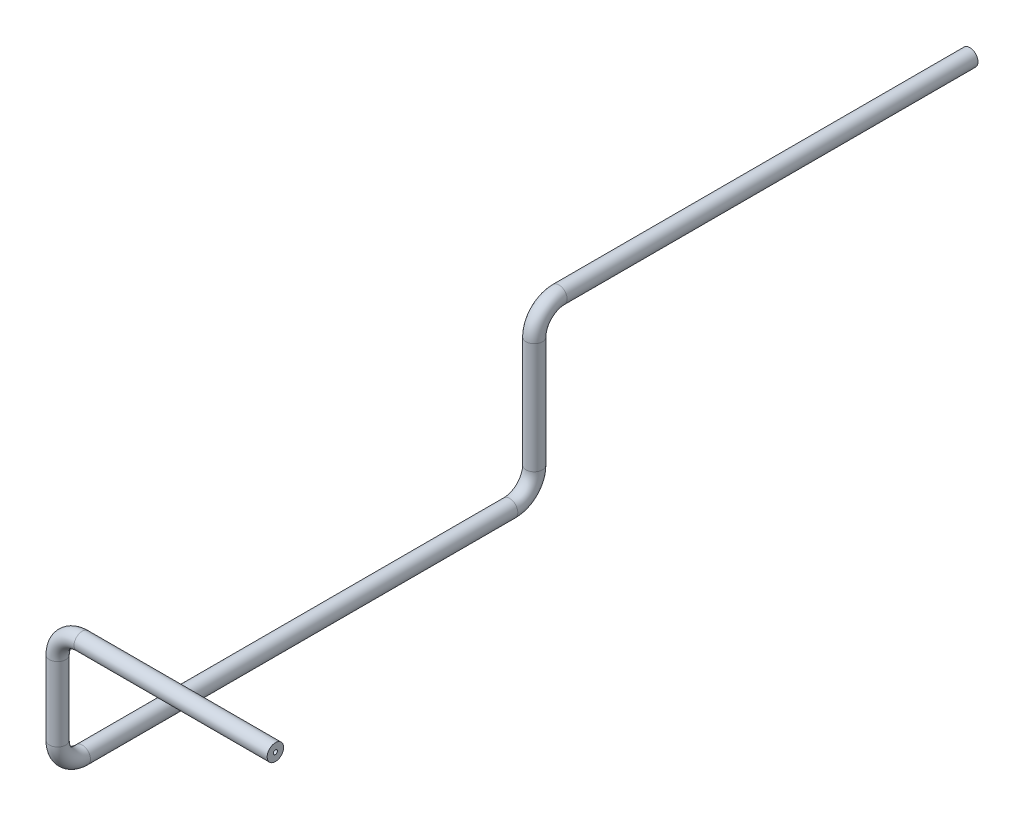
ISO-10303-21;
HEADER;
FILE_DESCRIPTION(('STEP AP214'),'2;1');
FILE_NAME('part.step','',(''),(''),'','','');
FILE_SCHEMA(('AUTOMOTIVE_DESIGN { 1 0 10303 214 1 1 1 1 }'));
ENDSEC;
DATA;
#1=APPLICATION_CONTEXT('core data for automotive mechanical design processes');
#2=APPLICATION_PROTOCOL_DEFINITION('international standard','automotive_design',2000,#1);
#3=PRODUCT_CONTEXT('',#1,'mechanical');
#4=PRODUCT('Part','Part','',(#3));
#5=PRODUCT_RELATED_PRODUCT_CATEGORY('part','',(#4));
#6=PRODUCT_DEFINITION_FORMATION('','',#4);
#7=PRODUCT_DEFINITION_CONTEXT('part definition',#1,'design');
#8=PRODUCT_DEFINITION('design','',#6,#7);
#9=PRODUCT_DEFINITION_SHAPE('','',#8);
#10=(LENGTH_UNIT() NAMED_UNIT(*) SI_UNIT(.MILLI.,.METRE.));
#11=(NAMED_UNIT(*) PLANE_ANGLE_UNIT() SI_UNIT($,.RADIAN.));
#12=(NAMED_UNIT(*) SI_UNIT($,.STERADIAN.) SOLID_ANGLE_UNIT());
#13=UNCERTAINTY_MEASURE_WITH_UNIT(LENGTH_MEASURE(1.E-05),#10,'distance_accuracy_value','');
#14=(GEOMETRIC_REPRESENTATION_CONTEXT(3) GLOBAL_UNCERTAINTY_ASSIGNED_CONTEXT((#13)) GLOBAL_UNIT_ASSIGNED_CONTEXT((#10,
#11,#12)) REPRESENTATION_CONTEXT('',''));
#15=CARTESIAN_POINT('',(0.,0.,0.));
#16=DIRECTION('',(0.,0.,1.));
#17=DIRECTION('',(1.,0.,0.));
#18=AXIS2_PLACEMENT_3D('',#15,#16,#17);
#19=CARTESIAN_POINT('',(-150.,480.,14.));
#20=DIRECTION('',(0.,0.,-1.));
#21=DIRECTION('',(0.,-1.,0.));
#22=AXIS2_PLACEMENT_3D('',#19,#20,#21);
#23=PLANE('',#22);
#24=CARTESIAN_POINT('',(-150.,480.,14.));
#25=DIRECTION('',(0.,0.,-1.));
#26=DIRECTION('',(0.,-1.,0.));
#27=AXIS2_PLACEMENT_3D('',#24,#25,#26);
#28=CIRCLE('',#27,0.5);
#29=CARTESIAN_POINT('',(-150.,479.5,14.));
#30=VERTEX_POINT('',#29);
#31=EDGE_CURVE('E311',#30,#30,#28,.T.);
#32=ORIENTED_EDGE('',*,*,#31,.F.);
#33=EDGE_LOOP('',(#32));
#34=FACE_BOUND('',#33,.T.);
#35=CARTESIAN_POINT('',(-150.,480.,14.));
#36=DIRECTION('',(0.,0.,-1.));
#37=DIRECTION('',(-1.,0.,0.));
#38=AXIS2_PLACEMENT_3D('',#35,#36,#37);
#39=CIRCLE('',#38,2.);
#40=CARTESIAN_POINT('',(-152.,480.,14.));
#41=VERTEX_POINT('',#40);
#42=EDGE_CURVE('E75',#41,#41,#39,.T.);
#43=ORIENTED_EDGE('',*,*,#42,.T.);
#44=EDGE_LOOP('',(#43));
#45=FACE_BOUND('',#44,.T.);
#46=ADVANCED_FACE('F52',(#34,#45),#23,.T.);
#47=CARTESIAN_POINT('',(-97.,471.,236.));
#48=DIRECTION('',(-1.,0.,0.));
#49=DIRECTION('',(0.,0.,1.));
#50=AXIS2_PLACEMENT_3D('',#47,#48,#49);
#51=PLANE('',#50);
#52=CARTESIAN_POINT('',(-97.,471.,236.));
#53=DIRECTION('',(-1.,0.,0.));
#54=DIRECTION('',(0.,0.,1.));
#55=AXIS2_PLACEMENT_3D('',#52,#53,#54);
#56=CIRCLE('',#55,0.5);
#57=CARTESIAN_POINT('',(-97.,471.,236.5));
#58=VERTEX_POINT('',#57);
#59=EDGE_CURVE('E73',#58,#58,#56,.T.);
#60=ORIENTED_EDGE('',*,*,#59,.T.);
#61=EDGE_LOOP('',(#60));
#62=FACE_BOUND('',#61,.T.);
#63=CARTESIAN_POINT('',(-97.,471.,236.));
#64=DIRECTION('',(-1.,0.,0.));
#65=DIRECTION('',(0.,0.,1.));
#66=AXIS2_PLACEMENT_3D('',#63,#64,#65);
#67=CIRCLE('',#66,2.);
#68=CARTESIAN_POINT('',(-97.,471.,238.));
#69=VERTEX_POINT('',#68);
#70=EDGE_CURVE('E11',#69,#69,#67,.T.);
#71=ORIENTED_EDGE('',*,*,#70,.F.);
#72=EDGE_LOOP('',(#71));
#73=FACE_BOUND('',#72,.T.);
#74=ADVANCED_FACE('F162',(#62,#73),#51,.F.);
#75=CARTESIAN_POINT('',(-150.,480.,14.));
#76=DIRECTION('',(0.,0.,1.));
#77=DIRECTION('',(1.,0.,0.));
#78=AXIS2_PLACEMENT_3D('',#75,#76,#77);
#79=CYLINDRICAL_SURFACE('',#78,2.);
#80=CARTESIAN_POINT('',(-150.,480.,114.));
#81=DIRECTION('',(0.,0.,1.));
#82=DIRECTION('',(1.,0.,0.));
#83=AXIS2_PLACEMENT_3D('',#80,#81,#82);
#84=CIRCLE('',#83,2.);
#85=CARTESIAN_POINT('',(-150.,482.,114.));
#86=VERTEX_POINT('',#85);
#87=EDGE_CURVE('E74',#86,#86,#84,.F.);
#88=ORIENTED_EDGE('',*,*,#87,.T.);
#89=EDGE_LOOP('',(#88));
#90=FACE_BOUND('',#89,.T.);
#91=ORIENTED_EDGE('',*,*,#42,.F.);
#92=EDGE_LOOP('',(#91));
#93=FACE_BOUND('',#92,.T.);
#94=ADVANCED_FACE('F167',(#90,#93),#79,.T.);
#95=CARTESIAN_POINT('',(-150.,474.,114.));
#96=DIRECTION('',(1.,0.,0.));
#97=DIRECTION('',(0.,0.,-1.));
#98=AXIS2_PLACEMENT_3D('',#95,#96,#97);
#99=TOROIDAL_SURFACE('',#98,6.00000000000001,2.);
#100=CARTESIAN_POINT('',(-150.,474.,120.));
#101=DIRECTION('',(0.,1.,0.));
#102=DIRECTION('',(0.,0.,1.));
#103=AXIS2_PLACEMENT_3D('',#100,#101,#102);
#104=CIRCLE('',#103,2.);
#105=CARTESIAN_POINT('',(-150.,474.,122.));
#106=VERTEX_POINT('',#105);
#107=EDGE_CURVE('E78',#106,#106,#104,.T.);
#108=CARTESIAN_POINT('',(-150.,474.,114.));
#109=DIRECTION('',(1.,0.,0.));
#110=DIRECTION('',(0.,0.,-1.));
#111=AXIS2_PLACEMENT_3D('',#108,#109,#110);
#112=CIRCLE('',#111,8.00000000000001);
#113=EDGE_CURVE('',#86,#106,#112,.T.);
#114=ORIENTED_EDGE('',*,*,#87,.F.);
#115=ORIENTED_EDGE('',*,*,#107,.T.);
#116=ORIENTED_EDGE('',*,*,#113,.T.);
#117=ORIENTED_EDGE('',*,*,#113,.F.);
#118=EDGE_LOOP('',(#114,#116,#115,#117));
#119=FACE_BOUND('',#118,.T.);
#120=ADVANCED_FACE('F171',(#119),#99,.T.);
#121=CARTESIAN_POINT('',(-150.,474.,120.));
#122=DIRECTION('',(0.,-1.,0.));
#123=DIRECTION('',(0.,0.,-1.));
#124=AXIS2_PLACEMENT_3D('',#121,#122,#123);
#125=CYLINDRICAL_SURFACE('',#124,2.);
#126=CARTESIAN_POINT('',(-150.,447.,120.));
#127=DIRECTION('',(0.,-1.,0.));
#128=DIRECTION('',(0.,0.,-1.));
#129=AXIS2_PLACEMENT_3D('',#126,#127,#128);
#130=CIRCLE('',#129,2.);
#131=CARTESIAN_POINT('',(-150.,447.,118.));
#132=VERTEX_POINT('',#131);
#133=EDGE_CURVE('E91',#132,#132,#130,.F.);
#134=ORIENTED_EDGE('',*,*,#133,.T.);
#135=EDGE_LOOP('',(#134));
#136=FACE_BOUND('',#135,.T.);
#137=ORIENTED_EDGE('',*,*,#107,.F.);
#138=EDGE_LOOP('',(#137));
#139=FACE_BOUND('',#138,.T.);
#140=ADVANCED_FACE('F176',(#136,#139),#125,.T.);
#141=CARTESIAN_POINT('',(-150.,447.,126.));
#142=DIRECTION('',(-1.,0.,0.));
#143=DIRECTION('',(0.,0.,1.));
#144=AXIS2_PLACEMENT_3D('',#141,#142,#143);
#145=TOROIDAL_SURFACE('',#144,6.00000000000003,2.);
#146=CARTESIAN_POINT('',(-150.,441.,126.));
#147=DIRECTION('',(0.,0.,-1.));
#148=DIRECTION('',(0.,1.,0.));
#149=AXIS2_PLACEMENT_3D('',#146,#147,#148);
#150=CIRCLE('',#149,2.);
#151=CARTESIAN_POINT('',(-150.,439.,126.));
#152=VERTEX_POINT('',#151);
#153=EDGE_CURVE('E96',#152,#152,#150,.T.);
#154=CARTESIAN_POINT('',(-150.,447.,126.));
#155=DIRECTION('',(-1.,0.,0.));
#156=DIRECTION('',(0.,0.,1.));
#157=AXIS2_PLACEMENT_3D('',#154,#155,#156);
#158=CIRCLE('',#157,8.00000000000003);
#159=EDGE_CURVE('',#132,#152,#158,.T.);
#160=ORIENTED_EDGE('',*,*,#133,.F.);
#161=ORIENTED_EDGE('',*,*,#153,.T.);
#162=ORIENTED_EDGE('',*,*,#159,.T.);
#163=ORIENTED_EDGE('',*,*,#159,.F.);
#164=EDGE_LOOP('',(#160,#162,#161,#163));
#165=FACE_BOUND('',#164,.T.);
#166=ADVANCED_FACE('F179',(#165),#145,.T.);
#167=CARTESIAN_POINT('',(-150.,441.,126.));
#168=DIRECTION('',(0.,0.,1.));
#169=DIRECTION('',(1.,0.,0.));
#170=AXIS2_PLACEMENT_3D('',#167,#168,#169);
#171=CYLINDRICAL_SURFACE('',#170,2.);
#172=CARTESIAN_POINT('',(-150.,441.,230.));
#173=DIRECTION('',(0.,0.,1.));
#174=DIRECTION('',(1.,0.,0.));
#175=AXIS2_PLACEMENT_3D('',#172,#173,#174);
#176=CIRCLE('',#175,2.);
#177=CARTESIAN_POINT('',(-150.,439.,230.));
#178=VERTEX_POINT('',#177);
#179=EDGE_CURVE('E97',#178,#178,#176,.F.);
#180=ORIENTED_EDGE('',*,*,#179,.T.);
#181=EDGE_LOOP('',(#180));
#182=FACE_BOUND('',#181,.T.);
#183=ORIENTED_EDGE('',*,*,#153,.F.);
#184=EDGE_LOOP('',(#183));
#185=FACE_BOUND('',#184,.T.);
#186=ADVANCED_FACE('F119',(#182,#185),#171,.T.);
#187=CARTESIAN_POINT('',(-150.,447.,230.));
#188=DIRECTION('',(-1.,0.,0.));
#189=DIRECTION('',(0.,0.,1.));
#190=AXIS2_PLACEMENT_3D('',#187,#188,#189);
#191=TOROIDAL_SURFACE('',#190,5.99999999999995,2.);
#192=CARTESIAN_POINT('',(-150.,447.,236.));
#193=DIRECTION('',(0.,-1.,0.));
#194=DIRECTION('',(0.,0.,-1.));
#195=AXIS2_PLACEMENT_3D('',#192,#193,#194);
#196=CIRCLE('',#195,2.);
#197=CARTESIAN_POINT('',(-150.,447.,238.));
#198=VERTEX_POINT('',#197);
#199=EDGE_CURVE('E68',#198,#198,#196,.T.);
#200=CARTESIAN_POINT('',(-150.,447.,230.));
#201=DIRECTION('',(-1.,0.,0.));
#202=DIRECTION('',(0.,0.,1.));
#203=AXIS2_PLACEMENT_3D('',#200,#201,#202);
#204=CIRCLE('',#203,7.99999999999995);
#205=EDGE_CURVE('',#178,#198,#204,.T.);
#206=ORIENTED_EDGE('',*,*,#179,.F.);
#207=ORIENTED_EDGE('',*,*,#199,.T.);
#208=ORIENTED_EDGE('',*,*,#205,.T.);
#209=ORIENTED_EDGE('',*,*,#205,.F.);
#210=EDGE_LOOP('',(#206,#208,#207,#209));
#211=FACE_BOUND('',#210,.T.);
#212=ADVANCED_FACE('F102',(#211),#191,.T.);
#213=CARTESIAN_POINT('',(-150.,447.,236.));
#214=DIRECTION('',(0.,1.,0.));
#215=DIRECTION('',(0.,0.,1.));
#216=AXIS2_PLACEMENT_3D('',#213,#214,#215);
#217=CYLINDRICAL_SURFACE('',#216,2.);
#218=CARTESIAN_POINT('',(-150.,465.,236.));
#219=DIRECTION('',(0.,1.,0.));
#220=DIRECTION('',(0.,0.,1.));
#221=AXIS2_PLACEMENT_3D('',#218,#219,#220);
#222=CIRCLE('',#221,2.);
#223=CARTESIAN_POINT('',(-152.,465.,236.));
#224=VERTEX_POINT('',#223);
#225=EDGE_CURVE('E63',#224,#224,#222,.F.);
#226=ORIENTED_EDGE('',*,*,#225,.T.);
#227=EDGE_LOOP('',(#226));
#228=FACE_BOUND('',#227,.T.);
#229=ORIENTED_EDGE('',*,*,#199,.F.);
#230=EDGE_LOOP('',(#229));
#231=FACE_BOUND('',#230,.T.);
#232=ADVANCED_FACE('F110',(#228,#231),#217,.T.);
#233=CARTESIAN_POINT('',(-144.,465.,236.));
#234=DIRECTION('',(0.,0.,-1.));
#235=DIRECTION('',(-1.,0.,0.));
#236=AXIS2_PLACEMENT_3D('',#233,#234,#235);
#237=TOROIDAL_SURFACE('',#236,5.99999999999998,2.);
#238=CARTESIAN_POINT('',(-144.,471.,236.));
#239=DIRECTION('',(-1.,0.,0.));
#240=DIRECTION('',(0.,-1.,0.));
#241=AXIS2_PLACEMENT_3D('',#238,#239,#240);
#242=CIRCLE('',#241,2.);
#243=CARTESIAN_POINT('',(-144.,473.,236.));
#244=VERTEX_POINT('',#243);
#245=EDGE_CURVE('E58',#244,#244,#242,.T.);
#246=CARTESIAN_POINT('',(-144.,465.,236.));
#247=DIRECTION('',(0.,0.,-1.));
#248=DIRECTION('',(-1.,0.,0.));
#249=AXIS2_PLACEMENT_3D('',#246,#247,#248);
#250=CIRCLE('',#249,7.99999999999998);
#251=EDGE_CURVE('',#224,#244,#250,.T.);
#252=ORIENTED_EDGE('',*,*,#225,.F.);
#253=ORIENTED_EDGE('',*,*,#245,.T.);
#254=ORIENTED_EDGE('',*,*,#251,.T.);
#255=ORIENTED_EDGE('',*,*,#251,.F.);
#256=EDGE_LOOP('',(#252,#254,#253,#255));
#257=FACE_BOUND('',#256,.T.);
#258=ADVANCED_FACE('F108',(#257),#237,.T.);
#259=CARTESIAN_POINT('',(-144.,471.,236.));
#260=DIRECTION('',(1.,0.,0.));
#261=DIRECTION('',(0.,0.,-1.));
#262=AXIS2_PLACEMENT_3D('',#259,#260,#261);
#263=CYLINDRICAL_SURFACE('',#262,2.);
#264=ORIENTED_EDGE('',*,*,#70,.T.);
#265=EDGE_LOOP('',(#264));
#266=FACE_BOUND('',#265,.T.);
#267=ORIENTED_EDGE('',*,*,#245,.F.);
#268=EDGE_LOOP('',(#267));
#269=FACE_BOUND('',#268,.T.);
#270=ADVANCED_FACE('F54',(#266,#269),#263,.T.);
#271=CARTESIAN_POINT('',(-150.,480.,14.));
#272=DIRECTION('',(0.,0.,1.));
#273=DIRECTION('',(1.,0.,0.));
#274=AXIS2_PLACEMENT_3D('',#271,#272,#273);
#275=CYLINDRICAL_SURFACE('',#274,0.5);
#276=CARTESIAN_POINT('',(-150.,480.,114.));
#277=DIRECTION('',(0.,0.,-1.));
#278=DIRECTION('',(0.,-1.,0.));
#279=AXIS2_PLACEMENT_3D('',#276,#277,#278);
#280=CIRCLE('',#279,0.5);
#281=CARTESIAN_POINT('',(-150.,480.5,114.));
#282=VERTEX_POINT('',#281);
#283=EDGE_CURVE('E314',#282,#282,#280,.T.);
#284=ORIENTED_EDGE('',*,*,#283,.F.);
#285=EDGE_LOOP('',(#284));
#286=FACE_BOUND('',#285,.T.);
#287=ORIENTED_EDGE('',*,*,#31,.T.);
#288=EDGE_LOOP('',(#287));
#289=FACE_BOUND('',#288,.T.);
#290=ADVANCED_FACE('F118',(#286,#289),#275,.F.);
#291=CARTESIAN_POINT('',(-150.,474.,114.));
#292=DIRECTION('',(1.,0.,0.));
#293=DIRECTION('',(0.,0.,-1.));
#294=AXIS2_PLACEMENT_3D('',#291,#292,#293);
#295=TOROIDAL_SURFACE('',#294,6.00000000000001,0.5);
#296=CARTESIAN_POINT('',(-150.,474.,120.));
#297=DIRECTION('',(0.,1.,0.));
#298=DIRECTION('',(0.,0.,-1.));
#299=AXIS2_PLACEMENT_3D('',#296,#297,#298);
#300=CIRCLE('',#299,0.5);
#301=CARTESIAN_POINT('',(-150.,474.,120.5));
#302=VERTEX_POINT('',#301);
#303=EDGE_CURVE('E320',#302,#302,#300,.T.);
#304=CARTESIAN_POINT('',(-150.,474.,114.));
#305=DIRECTION('',(1.,0.,0.));
#306=DIRECTION('',(0.,0.,-1.));
#307=AXIS2_PLACEMENT_3D('',#304,#305,#306);
#308=CIRCLE('',#307,6.50000000000001);
#309=EDGE_CURVE('',#282,#302,#308,.T.);
#310=ORIENTED_EDGE('',*,*,#283,.T.);
#311=ORIENTED_EDGE('',*,*,#303,.F.);
#312=ORIENTED_EDGE('',*,*,#309,.T.);
#313=ORIENTED_EDGE('',*,*,#309,.F.);
#314=EDGE_LOOP('',(#310,#312,#311,#313));
#315=FACE_BOUND('',#314,.T.);
#316=ADVANCED_FACE('F122',(#315),#295,.F.);
#317=CARTESIAN_POINT('',(-150.,474.,120.));
#318=DIRECTION('',(0.,-1.,0.));
#319=DIRECTION('',(0.,0.,-1.));
#320=AXIS2_PLACEMENT_3D('',#317,#318,#319);
#321=CYLINDRICAL_SURFACE('',#320,0.5);
#322=CARTESIAN_POINT('',(-150.,447.,120.));
#323=DIRECTION('',(0.,1.,0.));
#324=DIRECTION('',(0.,0.,-1.));
#325=AXIS2_PLACEMENT_3D('',#322,#323,#324);
#326=CIRCLE('',#325,0.5);
#327=CARTESIAN_POINT('',(-150.,447.,119.5));
#328=VERTEX_POINT('',#327);
#329=EDGE_CURVE('E325',#328,#328,#326,.T.);
#330=ORIENTED_EDGE('',*,*,#329,.F.);
#331=EDGE_LOOP('',(#330));
#332=FACE_BOUND('',#331,.T.);
#333=ORIENTED_EDGE('',*,*,#303,.T.);
#334=EDGE_LOOP('',(#333));
#335=FACE_BOUND('',#334,.T.);
#336=ADVANCED_FACE('F128',(#332,#335),#321,.F.);
#337=CARTESIAN_POINT('',(-150.,447.,126.));
#338=DIRECTION('',(-1.,0.,0.));
#339=DIRECTION('',(0.,0.,1.));
#340=AXIS2_PLACEMENT_3D('',#337,#338,#339);
#341=TOROIDAL_SURFACE('',#340,6.00000000000003,0.5);
#342=CARTESIAN_POINT('',(-150.,441.,126.));
#343=DIRECTION('',(0.,0.,-1.));
#344=DIRECTION('',(0.,-1.,0.));
#345=AXIS2_PLACEMENT_3D('',#342,#343,#344);
#346=CIRCLE('',#345,0.5);
#347=CARTESIAN_POINT('',(-150.,440.5,126.));
#348=VERTEX_POINT('',#347);
#349=EDGE_CURVE('E324',#348,#348,#346,.T.);
#350=CARTESIAN_POINT('',(-150.,447.,126.));
#351=DIRECTION('',(-1.,0.,0.));
#352=DIRECTION('',(0.,0.,1.));
#353=AXIS2_PLACEMENT_3D('',#350,#351,#352);
#354=CIRCLE('',#353,6.50000000000003);
#355=EDGE_CURVE('',#328,#348,#354,.T.);
#356=ORIENTED_EDGE('',*,*,#329,.T.);
#357=ORIENTED_EDGE('',*,*,#349,.F.);
#358=ORIENTED_EDGE('',*,*,#355,.T.);
#359=ORIENTED_EDGE('',*,*,#355,.F.);
#360=EDGE_LOOP('',(#356,#358,#357,#359));
#361=FACE_BOUND('',#360,.T.);
#362=ADVANCED_FACE('F137',(#361),#341,.F.);
#363=CARTESIAN_POINT('',(-150.,441.,126.));
#364=DIRECTION('',(0.,0.,1.));
#365=DIRECTION('',(1.,0.,0.));
#366=AXIS2_PLACEMENT_3D('',#363,#364,#365);
#367=CYLINDRICAL_SURFACE('',#366,0.5);
#368=CARTESIAN_POINT('',(-150.,441.,230.));
#369=DIRECTION('',(0.,0.,-1.));
#370=DIRECTION('',(0.,-1.,0.));
#371=AXIS2_PLACEMENT_3D('',#368,#369,#370);
#372=CIRCLE('',#371,0.5);
#373=CARTESIAN_POINT('',(-150.,440.5,230.));
#374=VERTEX_POINT('',#373);
#375=EDGE_CURVE('E327',#374,#374,#372,.T.);
#376=ORIENTED_EDGE('',*,*,#375,.F.);
#377=EDGE_LOOP('',(#376));
#378=FACE_BOUND('',#377,.T.);
#379=ORIENTED_EDGE('',*,*,#349,.T.);
#380=EDGE_LOOP('',(#379));
#381=FACE_BOUND('',#380,.T.);
#382=ADVANCED_FACE('F142',(#378,#381),#367,.F.);
#383=CARTESIAN_POINT('',(-150.,447.,230.));
#384=DIRECTION('',(-1.,0.,0.));
#385=DIRECTION('',(0.,0.,1.));
#386=AXIS2_PLACEMENT_3D('',#383,#384,#385);
#387=TOROIDAL_SURFACE('',#386,5.99999999999995,0.5);
#388=CARTESIAN_POINT('',(-150.,447.,236.));
#389=DIRECTION('',(0.,-1.,0.));
#390=DIRECTION('',(0.,0.,1.));
#391=AXIS2_PLACEMENT_3D('',#388,#389,#390);
#392=CIRCLE('',#391,0.5);
#393=CARTESIAN_POINT('',(-150.,447.,236.5));
#394=VERTEX_POINT('',#393);
#395=EDGE_CURVE('E332',#394,#394,#392,.T.);
#396=CARTESIAN_POINT('',(-150.,447.,230.));
#397=DIRECTION('',(-1.,0.,0.));
#398=DIRECTION('',(0.,0.,1.));
#399=AXIS2_PLACEMENT_3D('',#396,#397,#398);
#400=CIRCLE('',#399,6.49999999999995);
#401=EDGE_CURVE('',#374,#394,#400,.T.);
#402=ORIENTED_EDGE('',*,*,#375,.T.);
#403=ORIENTED_EDGE('',*,*,#395,.F.);
#404=ORIENTED_EDGE('',*,*,#401,.T.);
#405=ORIENTED_EDGE('',*,*,#401,.F.);
#406=EDGE_LOOP('',(#402,#404,#403,#405));
#407=FACE_BOUND('',#406,.T.);
#408=ADVANCED_FACE('F148',(#407),#387,.F.);
#409=CARTESIAN_POINT('',(-150.,447.,236.));
#410=DIRECTION('',(0.,1.,0.));
#411=DIRECTION('',(0.,0.,1.));
#412=AXIS2_PLACEMENT_3D('',#409,#410,#411);
#413=CYLINDRICAL_SURFACE('',#412,0.5);
#414=CARTESIAN_POINT('',(-150.,465.,236.));
#415=DIRECTION('',(0.,-1.,0.));
#416=DIRECTION('',(0.,0.,1.));
#417=AXIS2_PLACEMENT_3D('',#414,#415,#416);
#418=CIRCLE('',#417,0.5);
#419=CARTESIAN_POINT('',(-150.5,465.,236.));
#420=VERTEX_POINT('',#419);
#421=EDGE_CURVE('E87',#420,#420,#418,.T.);
#422=ORIENTED_EDGE('',*,*,#421,.F.);
#423=EDGE_LOOP('',(#422));
#424=FACE_BOUND('',#423,.T.);
#425=ORIENTED_EDGE('',*,*,#395,.T.);
#426=EDGE_LOOP('',(#425));
#427=FACE_BOUND('',#426,.T.);
#428=ADVANCED_FACE('F147',(#424,#427),#413,.F.);
#429=CARTESIAN_POINT('',(-144.,465.,236.));
#430=DIRECTION('',(0.,0.,-1.));
#431=DIRECTION('',(-1.,0.,0.));
#432=AXIS2_PLACEMENT_3D('',#429,#430,#431);
#433=TOROIDAL_SURFACE('',#432,5.99999999999998,0.5);
#434=CARTESIAN_POINT('',(-144.,471.,236.));
#435=DIRECTION('',(-1.,0.,0.));
#436=DIRECTION('',(0.,0.,1.));
#437=AXIS2_PLACEMENT_3D('',#434,#435,#436);
#438=CIRCLE('',#437,0.5);
#439=CARTESIAN_POINT('',(-144.,471.5,236.));
#440=VERTEX_POINT('',#439);
#441=EDGE_CURVE('E85',#440,#440,#438,.T.);
#442=CARTESIAN_POINT('',(-144.,465.,236.));
#443=DIRECTION('',(0.,0.,-1.));
#444=DIRECTION('',(-1.,0.,0.));
#445=AXIS2_PLACEMENT_3D('',#442,#443,#444);
#446=CIRCLE('',#445,6.49999999999998);
#447=EDGE_CURVE('',#420,#440,#446,.T.);
#448=ORIENTED_EDGE('',*,*,#421,.T.);
#449=ORIENTED_EDGE('',*,*,#441,.F.);
#450=ORIENTED_EDGE('',*,*,#447,.T.);
#451=ORIENTED_EDGE('',*,*,#447,.F.);
#452=EDGE_LOOP('',(#448,#450,#449,#451));
#453=FACE_BOUND('',#452,.T.);
#454=ADVANCED_FACE('F152',(#453),#433,.F.);
#455=CARTESIAN_POINT('',(-144.,471.,236.));
#456=DIRECTION('',(1.,0.,0.));
#457=DIRECTION('',(0.,0.,-1.));
#458=AXIS2_PLACEMENT_3D('',#455,#456,#457);
#459=CYLINDRICAL_SURFACE('',#458,0.5);
#460=ORIENTED_EDGE('',*,*,#59,.F.);
#461=EDGE_LOOP('',(#460));
#462=FACE_BOUND('',#461,.T.);
#463=ORIENTED_EDGE('',*,*,#441,.T.);
#464=EDGE_LOOP('',(#463));
#465=FACE_BOUND('',#464,.T.);
#466=ADVANCED_FACE('F158',(#462,#465),#459,.F.);
#467=CLOSED_SHELL('',(#46,#74,#94,#120,#140,#166,#186,#212,#232,#258,#270,#290,#316,#336,#362,
#382,#408,#428,#454,#466));
#468=MANIFOLD_SOLID_BREP('B2',#467);
#469=ADVANCED_BREP_SHAPE_REPRESENTATION('',(#18,#468),#14);
#470=SHAPE_DEFINITION_REPRESENTATION(#9,#469);
ENDSEC;
END-ISO-10303-21;
